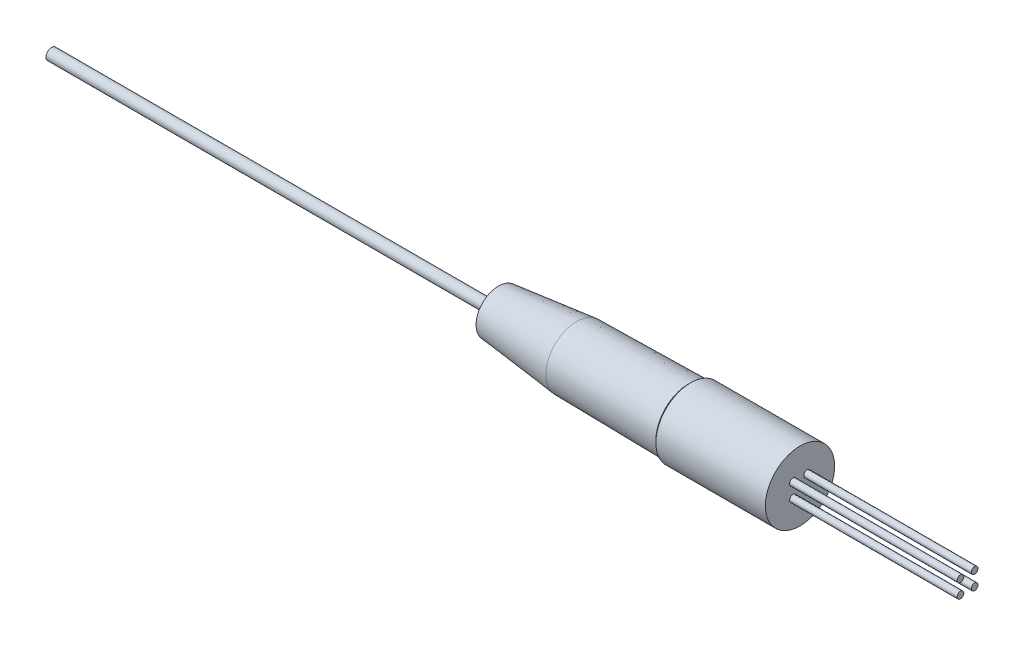
ISO-10303-21;
HEADER;
FILE_DESCRIPTION(('STEP AP214'),'2;1');
FILE_NAME('part.step','',(''),(''),'','','');
FILE_SCHEMA(('AUTOMOTIVE_DESIGN { 1 0 10303 214 1 1 1 1 }'));
ENDSEC;
DATA;
#1=APPLICATION_CONTEXT('core data for automotive mechanical design processes');
#2=APPLICATION_PROTOCOL_DEFINITION('international standard','automotive_design',2000,#1);
#3=PRODUCT_CONTEXT('',#1,'mechanical');
#4=PRODUCT('Part','Part','',(#3));
#5=PRODUCT_RELATED_PRODUCT_CATEGORY('part','',(#4));
#6=PRODUCT_DEFINITION_FORMATION('','',#4);
#7=PRODUCT_DEFINITION_CONTEXT('part definition',#1,'design');
#8=PRODUCT_DEFINITION('design','',#6,#7);
#9=PRODUCT_DEFINITION_SHAPE('','',#8);
#10=(LENGTH_UNIT() NAMED_UNIT(*) SI_UNIT(.MILLI.,.METRE.));
#11=(NAMED_UNIT(*) PLANE_ANGLE_UNIT() SI_UNIT($,.RADIAN.));
#12=(NAMED_UNIT(*) SI_UNIT($,.STERADIAN.) SOLID_ANGLE_UNIT());
#13=UNCERTAINTY_MEASURE_WITH_UNIT(LENGTH_MEASURE(1.E-05),#10,'distance_accuracy_value','');
#14=(GEOMETRIC_REPRESENTATION_CONTEXT(3) GLOBAL_UNCERTAINTY_ASSIGNED_CONTEXT((#13)) GLOBAL_UNIT_ASSIGNED_CONTEXT((#10,
#11,#12)) REPRESENTATION_CONTEXT('',''));
#15=CARTESIAN_POINT('',(0.,0.,0.));
#16=DIRECTION('',(0.,0.,1.));
#17=DIRECTION('',(1.,0.,0.));
#18=AXIS2_PLACEMENT_3D('',#15,#16,#17);
#19=CARTESIAN_POINT('',(-27.,1.99999999999999,0.));
#20=DIRECTION('',(1.,0.,0.));
#21=DIRECTION('',(0.,1.,0.));
#22=AXIS2_PLACEMENT_3D('',#19,#20,#21);
#23=PLANE('',#22);
#24=CARTESIAN_POINT('',(-27.,0.,0.));
#25=DIRECTION('',(-1.,0.,0.));
#26=DIRECTION('',(0.,-1.,0.));
#27=AXIS2_PLACEMENT_3D('',#24,#25,#26);
#28=CIRCLE('',#27,1.99999999999999);
#29=CARTESIAN_POINT('',(-27.,-1.99999999999999,0.));
#30=VERTEX_POINT('',#29);
#31=EDGE_CURVE('E57',#30,#30,#28,.T.);
#32=ORIENTED_EDGE('',*,*,#31,.T.);
#33=EDGE_LOOP('',(#32));
#34=FACE_BOUND('',#33,.T.);
#35=CARTESIAN_POINT('',(-27.,0.,0.));
#36=DIRECTION('',(1.,0.,0.));
#37=DIRECTION('',(0.,1.,0.));
#38=AXIS2_PLACEMENT_3D('',#35,#36,#37);
#39=CIRCLE('',#38,0.5);
#40=CARTESIAN_POINT('',(-27.,0.5,0.));
#41=VERTEX_POINT('',#40);
#42=EDGE_CURVE('E10',#41,#41,#39,.F.);
#43=ORIENTED_EDGE('',*,*,#42,.F.);
#44=EDGE_LOOP('',(#43));
#45=FACE_BOUND('',#44,.T.);
#46=ADVANCED_FACE('F31',(#34,#45),#23,.F.);
#47=CARTESIAN_POINT('',(0.,0.,0.));
#48=DIRECTION('',(-1.,0.,0.));
#49=DIRECTION('',(0.,-1.,0.));
#50=AXIS2_PLACEMENT_3D('',#47,#48,#49);
#51=PLANE('',#50);
#52=CARTESIAN_POINT('',(0.,0.635000000000003,-0.634999999999999));
#53=DIRECTION('',(-1.,0.,0.));
#54=DIRECTION('',(0.,-1.,0.));
#55=AXIS2_PLACEMENT_3D('',#52,#53,#54);
#56=CIRCLE('',#55,0.3);
#57=CARTESIAN_POINT('',(0.,0.335000000000003,-0.634999999999999));
#58=VERTEX_POINT('',#57);
#59=EDGE_CURVE('E42',#58,#58,#56,.F.);
#60=ORIENTED_EDGE('',*,*,#59,.F.);
#61=EDGE_LOOP('',(#60));
#62=FACE_BOUND('',#61,.T.);
#63=CARTESIAN_POINT('',(0.,0.635,0.634999999999999));
#64=DIRECTION('',(-1.,0.,0.));
#65=DIRECTION('',(0.,-1.,0.));
#66=AXIS2_PLACEMENT_3D('',#63,#64,#65);
#67=CIRCLE('',#66,0.3);
#68=CARTESIAN_POINT('',(0.,0.335,0.634999999999999));
#69=VERTEX_POINT('',#68);
#70=EDGE_CURVE('E51',#69,#69,#67,.F.);
#71=ORIENTED_EDGE('',*,*,#70,.F.);
#72=EDGE_LOOP('',(#71));
#73=FACE_BOUND('',#72,.T.);
#74=CARTESIAN_POINT('',(0.,0.,0.));
#75=DIRECTION('',(-1.,0.,0.));
#76=DIRECTION('',(0.,-1.,0.));
#77=AXIS2_PLACEMENT_3D('',#74,#75,#76);
#78=CIRCLE('',#77,3.1);
#79=CARTESIAN_POINT('',(0.,-3.1,0.));
#80=VERTEX_POINT('',#79);
#81=EDGE_CURVE('E66',#80,#80,#78,.T.);
#82=ORIENTED_EDGE('',*,*,#81,.F.);
#83=EDGE_LOOP('',(#82));
#84=FACE_BOUND('',#83,.T.);
#85=CARTESIAN_POINT('',(0.,-0.635,0.634999999999999));
#86=DIRECTION('',(-1.,0.,0.));
#87=DIRECTION('',(0.,-1.,0.));
#88=AXIS2_PLACEMENT_3D('',#85,#86,#87);
#89=CIRCLE('',#88,0.3);
#90=CARTESIAN_POINT('',(0.,-0.935,0.634999999999999));
#91=VERTEX_POINT('',#90);
#92=EDGE_CURVE('E46',#91,#91,#89,.F.);
#93=ORIENTED_EDGE('',*,*,#92,.F.);
#94=EDGE_LOOP('',(#93));
#95=FACE_BOUND('',#94,.T.);
#96=CARTESIAN_POINT('',(0.,-0.634999999999996,-0.634999999999999));
#97=DIRECTION('',(-1.,0.,0.));
#98=DIRECTION('',(0.,-1.,0.));
#99=AXIS2_PLACEMENT_3D('',#96,#97,#98);
#100=CIRCLE('',#99,0.3);
#101=CARTESIAN_POINT('',(0.,-0.934999999999996,-0.634999999999999));
#102=VERTEX_POINT('',#101);
#103=EDGE_CURVE('E38',#102,#102,#100,.F.);
#104=ORIENTED_EDGE('',*,*,#103,.F.);
#105=EDGE_LOOP('',(#104));
#106=FACE_BOUND('',#105,.T.);
#107=ADVANCED_FACE('F101',(#62,#73,#84,#95,#106),#51,.F.);
#108=CARTESIAN_POINT('',(-20.,0.,0.));
#109=DIRECTION('',(1.,0.,0.));
#110=DIRECTION('',(0.,1.,0.));
#111=AXIS2_PLACEMENT_3D('',#108,#109,#110);
#112=CONICAL_SURFACE('',#111,2.75,0.106735672649136);
#113=ORIENTED_EDGE('',*,*,#31,.F.);
#114=EDGE_LOOP('',(#113));
#115=FACE_BOUND('',#114,.T.);
#116=CARTESIAN_POINT('',(-20.,0.,0.));
#117=DIRECTION('',(-1.,0.,0.));
#118=DIRECTION('',(0.,-1.,0.));
#119=AXIS2_PLACEMENT_3D('',#116,#117,#118);
#120=CIRCLE('',#119,2.75);
#121=CARTESIAN_POINT('',(-20.,-2.75,0.));
#122=VERTEX_POINT('',#121);
#123=EDGE_CURVE('E60',#122,#122,#120,.T.);
#124=ORIENTED_EDGE('',*,*,#123,.T.);
#125=EDGE_LOOP('',(#124));
#126=FACE_BOUND('',#125,.T.);
#127=ADVANCED_FACE('F108',(#115,#126),#112,.T.);
#128=CARTESIAN_POINT('',(-10.,0.,0.));
#129=DIRECTION('',(1.,0.,0.));
#130=DIRECTION('',(0.,1.,0.));
#131=AXIS2_PLACEMENT_3D('',#128,#129,#130);
#132=CONICAL_SURFACE('',#131,2.9,0.0149988751518507);
#133=ORIENTED_EDGE('',*,*,#123,.F.);
#134=EDGE_LOOP('',(#133));
#135=FACE_BOUND('',#134,.T.);
#136=CARTESIAN_POINT('',(-10.,0.,0.));
#137=DIRECTION('',(-1.,0.,0.));
#138=DIRECTION('',(0.,-1.,0.));
#139=AXIS2_PLACEMENT_3D('',#136,#137,#138);
#140=CIRCLE('',#139,2.9);
#141=CARTESIAN_POINT('',(-10.,-2.9,0.));
#142=VERTEX_POINT('',#141);
#143=EDGE_CURVE('E63',#142,#142,#140,.T.);
#144=ORIENTED_EDGE('',*,*,#143,.T.);
#145=EDGE_LOOP('',(#144));
#146=FACE_BOUND('',#145,.T.);
#147=ADVANCED_FACE('F114',(#135,#146),#132,.T.);
#148=CARTESIAN_POINT('',(-27.,0.,0.));
#149=DIRECTION('',(-1.,0.,0.));
#150=DIRECTION('',(0.,-1.,0.));
#151=AXIS2_PLACEMENT_3D('',#148,#149,#150);
#152=CYLINDRICAL_SURFACE('',#151,3.1);
#153=CARTESIAN_POINT('',(-9.80000000000001,0.,0.));
#154=DIRECTION('',(1.,0.,0.));
#155=DIRECTION('',(0.,1.,0.));
#156=AXIS2_PLACEMENT_3D('',#153,#154,#155);
#157=CIRCLE('',#156,3.1);
#158=CARTESIAN_POINT('',(-9.80000000000001,3.1,0.));
#159=VERTEX_POINT('',#158);
#160=EDGE_CURVE('E54',#159,#159,#157,.T.);
#161=ORIENTED_EDGE('',*,*,#160,.T.);
#162=EDGE_LOOP('',(#161));
#163=FACE_BOUND('',#162,.T.);
#164=ORIENTED_EDGE('',*,*,#81,.T.);
#165=EDGE_LOOP('',(#164));
#166=FACE_BOUND('',#165,.T.);
#167=ADVANCED_FACE('F118',(#163,#166),#152,.T.);
#168=CARTESIAN_POINT('',(-10.,0.,0.));
#169=DIRECTION('',(1.,0.,0.));
#170=DIRECTION('',(0.,1.,0.));
#171=AXIS2_PLACEMENT_3D('',#168,#169,#170);
#172=CONICAL_SURFACE('',#171,2.9,0.785398163397456);
#173=ORIENTED_EDGE('',*,*,#160,.F.);
#174=EDGE_LOOP('',(#173));
#175=FACE_BOUND('',#174,.T.);
#176=ORIENTED_EDGE('',*,*,#143,.F.);
#177=EDGE_LOOP('',(#176));
#178=FACE_BOUND('',#177,.T.);
#179=ADVANCED_FACE('F33',(#175,#178),#172,.T.);
#180=CARTESIAN_POINT('',(15.,0.635,0.634999999999999));
#181=DIRECTION('',(-1.,0.,0.));
#182=DIRECTION('',(0.,-1.,0.));
#183=AXIS2_PLACEMENT_3D('',#180,#181,#182);
#184=CYLINDRICAL_SURFACE('',#183,0.3);
#185=CARTESIAN_POINT('',(15.,0.635,0.634999999999999));
#186=DIRECTION('',(1.,0.,0.));
#187=DIRECTION('',(0.,1.,0.));
#188=AXIS2_PLACEMENT_3D('',#185,#186,#187);
#189=CIRCLE('',#188,0.3);
#190=CARTESIAN_POINT('',(15.,0.935,0.634999999999999));
#191=VERTEX_POINT('',#190);
#192=EDGE_CURVE('E69',#191,#191,#189,.T.);
#193=ORIENTED_EDGE('',*,*,#192,.F.);
#194=EDGE_LOOP('',(#193));
#195=FACE_BOUND('',#194,.T.);
#196=ORIENTED_EDGE('',*,*,#70,.T.);
#197=EDGE_LOOP('',(#196));
#198=FACE_BOUND('',#197,.T.);
#199=ADVANCED_FACE('F123',(#195,#198),#184,.T.);
#200=CARTESIAN_POINT('',(15.,0.635,0.634999999999999));
#201=DIRECTION('',(1.,0.,0.));
#202=DIRECTION('',(0.,1.,0.));
#203=AXIS2_PLACEMENT_3D('',#200,#201,#202);
#204=PLANE('',#203);
#205=ORIENTED_EDGE('',*,*,#192,.T.);
#206=EDGE_LOOP('',(#205));
#207=FACE_BOUND('',#206,.T.);
#208=ADVANCED_FACE('F126',(#207),#204,.T.);
#209=CARTESIAN_POINT('',(15.,-0.635,0.634999999999999));
#210=DIRECTION('',(-1.,0.,0.));
#211=DIRECTION('',(0.,-1.,0.));
#212=AXIS2_PLACEMENT_3D('',#209,#210,#211);
#213=CYLINDRICAL_SURFACE('',#212,0.3);
#214=CARTESIAN_POINT('',(15.,-0.635,0.634999999999999));
#215=DIRECTION('',(1.,0.,0.));
#216=DIRECTION('',(0.,-1.,0.));
#217=AXIS2_PLACEMENT_3D('',#214,#215,#216);
#218=CIRCLE('',#217,0.3);
#219=CARTESIAN_POINT('',(15.,-0.935,0.634999999999999));
#220=VERTEX_POINT('',#219);
#221=EDGE_CURVE('E72',#220,#220,#218,.T.);
#222=ORIENTED_EDGE('',*,*,#221,.F.);
#223=EDGE_LOOP('',(#222));
#224=FACE_BOUND('',#223,.T.);
#225=ORIENTED_EDGE('',*,*,#92,.T.);
#226=EDGE_LOOP('',(#225));
#227=FACE_BOUND('',#226,.T.);
#228=ADVANCED_FACE('F130',(#224,#227),#213,.T.);
#229=CARTESIAN_POINT('',(15.,-0.635,0.634999999999999));
#230=DIRECTION('',(-1.,0.,0.));
#231=DIRECTION('',(0.,-1.,0.));
#232=AXIS2_PLACEMENT_3D('',#229,#230,#231);
#233=PLANE('',#232);
#234=ORIENTED_EDGE('',*,*,#221,.T.);
#235=EDGE_LOOP('',(#234));
#236=FACE_BOUND('',#235,.T.);
#237=ADVANCED_FACE('F134',(#236),#233,.F.);
#238=CARTESIAN_POINT('',(15.,0.635000000000003,-0.634999999999999));
#239=DIRECTION('',(-1.,0.,0.));
#240=DIRECTION('',(0.,-1.,0.));
#241=AXIS2_PLACEMENT_3D('',#238,#239,#240);
#242=CYLINDRICAL_SURFACE('',#241,0.3);
#243=CARTESIAN_POINT('',(15.,0.635000000000003,-0.634999999999999));
#244=DIRECTION('',(1.,0.,0.));
#245=DIRECTION('',(0.,-1.,0.));
#246=AXIS2_PLACEMENT_3D('',#243,#244,#245);
#247=CIRCLE('',#246,0.3);
#248=CARTESIAN_POINT('',(15.,0.335000000000003,-0.634999999999999));
#249=VERTEX_POINT('',#248);
#250=EDGE_CURVE('E75',#249,#249,#247,.T.);
#251=ORIENTED_EDGE('',*,*,#250,.F.);
#252=EDGE_LOOP('',(#251));
#253=FACE_BOUND('',#252,.T.);
#254=ORIENTED_EDGE('',*,*,#59,.T.);
#255=EDGE_LOOP('',(#254));
#256=FACE_BOUND('',#255,.T.);
#257=ADVANCED_FACE('F138',(#253,#256),#242,.T.);
#258=CARTESIAN_POINT('',(15.,0.635000000000003,-0.634999999999999));
#259=DIRECTION('',(-1.,0.,0.));
#260=DIRECTION('',(0.,-1.,0.));
#261=AXIS2_PLACEMENT_3D('',#258,#259,#260);
#262=PLANE('',#261);
#263=ORIENTED_EDGE('',*,*,#250,.T.);
#264=EDGE_LOOP('',(#263));
#265=FACE_BOUND('',#264,.T.);
#266=ADVANCED_FACE('F142',(#265),#262,.F.);
#267=CARTESIAN_POINT('',(15.,-0.634999999999997,-0.634999999999999));
#268=DIRECTION('',(-1.,0.,0.));
#269=DIRECTION('',(0.,-1.,0.));
#270=AXIS2_PLACEMENT_3D('',#267,#268,#269);
#271=CYLINDRICAL_SURFACE('',#270,0.3);
#272=CARTESIAN_POINT('',(15.,-0.634999999999997,-0.634999999999999));
#273=DIRECTION('',(1.,0.,0.));
#274=DIRECTION('',(0.,1.,0.));
#275=AXIS2_PLACEMENT_3D('',#272,#273,#274);
#276=CIRCLE('',#275,0.3);
#277=CARTESIAN_POINT('',(15.,-0.334999999999997,-0.634999999999999));
#278=VERTEX_POINT('',#277);
#279=EDGE_CURVE('E78',#278,#278,#276,.T.);
#280=ORIENTED_EDGE('',*,*,#279,.F.);
#281=EDGE_LOOP('',(#280));
#282=FACE_BOUND('',#281,.T.);
#283=ORIENTED_EDGE('',*,*,#103,.T.);
#284=EDGE_LOOP('',(#283));
#285=FACE_BOUND('',#284,.T.);
#286=ADVANCED_FACE('F97',(#282,#285),#271,.T.);
#287=CARTESIAN_POINT('',(15.,-0.634999999999997,-0.634999999999999));
#288=DIRECTION('',(1.,0.,0.));
#289=DIRECTION('',(0.,1.,0.));
#290=AXIS2_PLACEMENT_3D('',#287,#288,#289);
#291=PLANE('',#290);
#292=ORIENTED_EDGE('',*,*,#279,.T.);
#293=EDGE_LOOP('',(#292));
#294=FACE_BOUND('',#293,.T.);
#295=ADVANCED_FACE('F89',(#294),#291,.T.);
#296=CARTESIAN_POINT('',(-67.,0.,0.));
#297=DIRECTION('',(1.,0.,0.));
#298=DIRECTION('',(0.,1.,0.));
#299=AXIS2_PLACEMENT_3D('',#296,#297,#298);
#300=CYLINDRICAL_SURFACE('',#299,0.5);
#301=CARTESIAN_POINT('',(-67.,0.,0.));
#302=DIRECTION('',(-1.,0.,0.));
#303=DIRECTION('',(0.,-1.,0.));
#304=AXIS2_PLACEMENT_3D('',#301,#302,#303);
#305=CIRCLE('',#304,0.5);
#306=CARTESIAN_POINT('',(-67.,-0.499999999999999,0.));
#307=VERTEX_POINT('',#306);
#308=EDGE_CURVE('E81',#307,#307,#305,.T.);
#309=ORIENTED_EDGE('',*,*,#308,.F.);
#310=EDGE_LOOP('',(#309));
#311=FACE_BOUND('',#310,.T.);
#312=ORIENTED_EDGE('',*,*,#42,.T.);
#313=EDGE_LOOP('',(#312));
#314=FACE_BOUND('',#313,.T.);
#315=ADVANCED_FACE('F87',(#311,#314),#300,.T.);
#316=CARTESIAN_POINT('',(-67.,0.,0.));
#317=DIRECTION('',(-1.,0.,0.));
#318=DIRECTION('',(0.,-1.,0.));
#319=AXIS2_PLACEMENT_3D('',#316,#317,#318);
#320=PLANE('',#319);
#321=ORIENTED_EDGE('',*,*,#308,.T.);
#322=EDGE_LOOP('',(#321));
#323=FACE_BOUND('',#322,.T.);
#324=ADVANCED_FACE('F85',(#323),#320,.T.);
#325=CLOSED_SHELL('',(#46,#107,#127,#147,#167,#179,#199,#208,#228,#237,#257,#266,#286,#295,#315,#324));
#326=MANIFOLD_SOLID_BREP('B2',#325);
#327=ADVANCED_BREP_SHAPE_REPRESENTATION('',(#18,#326),#14);
#328=SHAPE_DEFINITION_REPRESENTATION(#9,#327);
ENDSEC;
END-ISO-10303-21;
